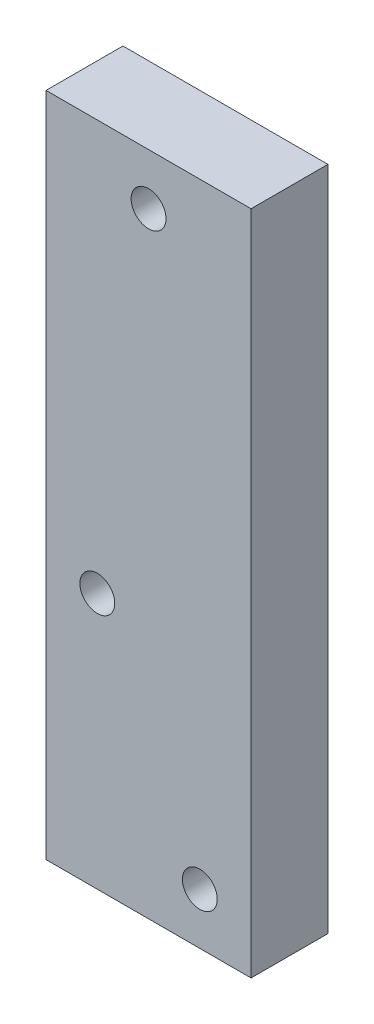
ISO-10303-21;
HEADER;
FILE_DESCRIPTION(('STEP AP214'),'2;1');
FILE_NAME('part.step','',(''),(''),'','','');
FILE_SCHEMA(('AUTOMOTIVE_DESIGN { 1 0 10303 214 1 1 1 1 }'));
ENDSEC;
DATA;
#1=APPLICATION_CONTEXT('core data for automotive mechanical design processes');
#2=APPLICATION_PROTOCOL_DEFINITION('international standard','automotive_design',2000,#1);
#3=PRODUCT_CONTEXT('',#1,'mechanical');
#4=PRODUCT('Part','Part','',(#3));
#5=PRODUCT_RELATED_PRODUCT_CATEGORY('part','',(#4));
#6=PRODUCT_DEFINITION_FORMATION('','',#4);
#7=PRODUCT_DEFINITION_CONTEXT('part definition',#1,'design');
#8=PRODUCT_DEFINITION('design','',#6,#7);
#9=PRODUCT_DEFINITION_SHAPE('','',#8);
#10=(LENGTH_UNIT() NAMED_UNIT(*) SI_UNIT(.MILLI.,.METRE.));
#11=(NAMED_UNIT(*) PLANE_ANGLE_UNIT() SI_UNIT($,.RADIAN.));
#12=(NAMED_UNIT(*) SI_UNIT($,.STERADIAN.) SOLID_ANGLE_UNIT());
#13=UNCERTAINTY_MEASURE_WITH_UNIT(LENGTH_MEASURE(1.E-05),#10,'distance_accuracy_value','');
#14=(GEOMETRIC_REPRESENTATION_CONTEXT(3) GLOBAL_UNCERTAINTY_ASSIGNED_CONTEXT((#13)) GLOBAL_UNIT_ASSIGNED_CONTEXT((#10,
#11,#12)) REPRESENTATION_CONTEXT('',''));
#15=CARTESIAN_POINT('',(0.,0.,0.));
#16=DIRECTION('',(0.,0.,1.));
#17=DIRECTION('',(1.,0.,0.));
#18=AXIS2_PLACEMENT_3D('',#15,#16,#17);
#19=CARTESIAN_POINT('',(0.,0.,9.525));
#20=DIRECTION('',(0.,0.,1.));
#21=DIRECTION('',(1.,0.,0.));
#22=AXIS2_PLACEMENT_3D('',#19,#20,#21);
#23=PLANE('',#22);
#24=CARTESIAN_POINT('',(-6.35,-44.45,9.525));
#25=DIRECTION('',(0.,0.,1.));
#26=DIRECTION('',(1.,0.,0.));
#27=AXIS2_PLACEMENT_3D('',#24,#25,#26);
#28=CIRCLE('',#27,2.159);
#29=CARTESIAN_POINT('',(-8.50900000000001,-44.45,9.525));
#30=VERTEX_POINT('',#29);
#31=EDGE_CURVE('E123',#30,#30,#28,.T.);
#32=ORIENTED_EDGE('',*,*,#31,.F.);
#33=EDGE_LOOP('',(#32));
#34=FACE_BOUND('',#33,.T.);
#35=DIRECTION('',(0.,-1.,0.));
#36=VECTOR('',#35,1.);
#37=CARTESIAN_POINT('',(-12.7,6.35,9.525));
#38=LINE('',#37,#36);
#39=CARTESIAN_POINT('',(-12.7,6.35,9.525));
#40=VERTEX_POINT('',#39);
#41=CARTESIAN_POINT('',(-12.7,-76.2,9.525));
#42=VERTEX_POINT('',#41);
#43=EDGE_CURVE('E93',#40,#42,#38,.T.);
#44=ORIENTED_EDGE('',*,*,#43,.T.);
#45=DIRECTION('',(1.,0.,0.));
#46=VECTOR('',#45,1.);
#47=CARTESIAN_POINT('',(-12.7,-76.2,9.525));
#48=LINE('',#47,#46);
#49=CARTESIAN_POINT('',(12.7,-76.2,9.525));
#50=VERTEX_POINT('',#49);
#51=EDGE_CURVE('E88',#42,#50,#48,.T.);
#52=ORIENTED_EDGE('',*,*,#51,.T.);
#53=DIRECTION('',(0.,1.,0.));
#54=VECTOR('',#53,1.);
#55=CARTESIAN_POINT('',(12.7,6.34999999999999,9.525));
#56=LINE('',#55,#54);
#57=CARTESIAN_POINT('',(12.7,6.34999999999999,9.525));
#58=VERTEX_POINT('',#57);
#59=EDGE_CURVE('E91',#50,#58,#56,.T.);
#60=ORIENTED_EDGE('',*,*,#59,.T.);
#61=DIRECTION('',(-1.,0.,0.));
#62=VECTOR('',#61,1.);
#63=CARTESIAN_POINT('',(-12.7,6.35,9.525));
#64=LINE('',#63,#62);
#65=EDGE_CURVE('E58',#58,#40,#64,.T.);
#66=ORIENTED_EDGE('',*,*,#65,.T.);
#67=EDGE_LOOP('',(#44,#52,#60,#66));
#68=FACE_BOUND('',#67,.T.);
#69=CARTESIAN_POINT('',(0.,0.,9.525));
#70=DIRECTION('',(0.,0.,1.));
#71=DIRECTION('',(1.,0.,0.));
#72=AXIS2_PLACEMENT_3D('',#69,#70,#71);
#73=CIRCLE('',#72,2.159);
#74=CARTESIAN_POINT('',(-2.159,0.,9.525));
#75=VERTEX_POINT('',#74);
#76=EDGE_CURVE('E108',#75,#75,#73,.T.);
#77=ORIENTED_EDGE('',*,*,#76,.F.);
#78=EDGE_LOOP('',(#77));
#79=FACE_BOUND('',#78,.T.);
#80=CARTESIAN_POINT('',(6.35,-69.85,9.525));
#81=DIRECTION('',(0.,0.,1.));
#82=DIRECTION('',(1.,0.,0.));
#83=AXIS2_PLACEMENT_3D('',#80,#81,#82);
#84=CIRCLE('',#83,2.159);
#85=CARTESIAN_POINT('',(4.191,-69.85,9.525));
#86=VERTEX_POINT('',#85);
#87=EDGE_CURVE('E129',#86,#86,#84,.T.);
#88=ORIENTED_EDGE('',*,*,#87,.F.);
#89=EDGE_LOOP('',(#88));
#90=FACE_BOUND('',#89,.T.);
#91=ADVANCED_FACE('F41',(#34,#68,#79,#90),#23,.T.);
#92=CARTESIAN_POINT('',(0.,0.,0.));
#93=DIRECTION('',(0.,0.,1.));
#94=DIRECTION('',(1.,0.,0.));
#95=AXIS2_PLACEMENT_3D('',#92,#93,#94);
#96=PLANE('',#95);
#97=DIRECTION('',(0.,-1.,0.));
#98=VECTOR('',#97,1.);
#99=CARTESIAN_POINT('',(-12.7,6.35,0.));
#100=LINE('',#99,#98);
#101=CARTESIAN_POINT('',(-12.7,6.35,0.));
#102=VERTEX_POINT('',#101);
#103=CARTESIAN_POINT('',(-12.7,-76.2,0.));
#104=VERTEX_POINT('',#103);
#105=EDGE_CURVE('E105',#102,#104,#100,.T.);
#106=ORIENTED_EDGE('',*,*,#105,.F.);
#107=DIRECTION('',(-1.,0.,0.));
#108=VECTOR('',#107,1.);
#109=CARTESIAN_POINT('',(-12.7,6.35,0.));
#110=LINE('',#109,#108);
#111=CARTESIAN_POINT('',(12.7,6.34999999999999,0.));
#112=VERTEX_POINT('',#111);
#113=EDGE_CURVE('E81',#112,#102,#110,.T.);
#114=ORIENTED_EDGE('',*,*,#113,.F.);
#115=DIRECTION('',(0.,1.,0.));
#116=VECTOR('',#115,1.);
#117=CARTESIAN_POINT('',(12.7,6.34999999999999,0.));
#118=LINE('',#117,#116);
#119=CARTESIAN_POINT('',(12.7,-76.2,0.));
#120=VERTEX_POINT('',#119);
#121=EDGE_CURVE('E75',#120,#112,#118,.T.);
#122=ORIENTED_EDGE('',*,*,#121,.F.);
#123=DIRECTION('',(1.,0.,0.));
#124=VECTOR('',#123,1.);
#125=CARTESIAN_POINT('',(-12.7,-76.2,0.));
#126=LINE('',#125,#124);
#127=EDGE_CURVE('E97',#104,#120,#126,.T.);
#128=ORIENTED_EDGE('',*,*,#127,.F.);
#129=EDGE_LOOP('',(#106,#114,#122,#128));
#130=FACE_BOUND('',#129,.T.);
#131=CARTESIAN_POINT('',(0.,0.,0.));
#132=DIRECTION('',(0.,0.,1.));
#133=DIRECTION('',(1.,0.,0.));
#134=AXIS2_PLACEMENT_3D('',#131,#132,#133);
#135=CIRCLE('',#134,2.159);
#136=CARTESIAN_POINT('',(-2.159,0.,0.));
#137=VERTEX_POINT('',#136);
#138=EDGE_CURVE('E120',#137,#137,#135,.T.);
#139=ORIENTED_EDGE('',*,*,#138,.T.);
#140=EDGE_LOOP('',(#139));
#141=FACE_BOUND('',#140,.T.);
#142=CARTESIAN_POINT('',(-6.35,-44.45,0.));
#143=DIRECTION('',(0.,0.,1.));
#144=DIRECTION('',(1.,0.,0.));
#145=AXIS2_PLACEMENT_3D('',#142,#143,#144);
#146=CIRCLE('',#145,2.159);
#147=CARTESIAN_POINT('',(-8.50900000000001,-44.45,0.));
#148=VERTEX_POINT('',#147);
#149=EDGE_CURVE('E126',#148,#148,#146,.T.);
#150=ORIENTED_EDGE('',*,*,#149,.T.);
#151=EDGE_LOOP('',(#150));
#152=FACE_BOUND('',#151,.T.);
#153=CARTESIAN_POINT('',(6.35,-69.85,0.));
#154=DIRECTION('',(0.,0.,1.));
#155=DIRECTION('',(1.,0.,0.));
#156=AXIS2_PLACEMENT_3D('',#153,#154,#155);
#157=CIRCLE('',#156,2.159);
#158=CARTESIAN_POINT('',(4.191,-69.85,0.));
#159=VERTEX_POINT('',#158);
#160=EDGE_CURVE('E132',#159,#159,#157,.T.);
#161=ORIENTED_EDGE('',*,*,#160,.T.);
#162=EDGE_LOOP('',(#161));
#163=FACE_BOUND('',#162,.T.);
#164=ADVANCED_FACE('F116',(#130,#141,#152,#163),#96,.F.);
#165=CARTESIAN_POINT('',(-12.7,6.35,9.525));
#166=DIRECTION('',(1.,0.,0.));
#167=DIRECTION('',(0.,1.,0.));
#168=AXIS2_PLACEMENT_3D('',#165,#166,#167);
#169=PLANE('',#168);
#170=ORIENTED_EDGE('',*,*,#105,.T.);
#171=DIRECTION('',(0.,0.,-1.));
#172=VECTOR('',#171,1.);
#173=CARTESIAN_POINT('',(-12.7,-76.2,9.525));
#174=LINE('',#173,#172);
#175=EDGE_CURVE('E11',#42,#104,#174,.T.);
#176=ORIENTED_EDGE('',*,*,#175,.F.);
#177=ORIENTED_EDGE('',*,*,#43,.F.);
#178=DIRECTION('',(0.,0.,-1.));
#179=VECTOR('',#178,1.);
#180=CARTESIAN_POINT('',(-12.7,6.35,9.525));
#181=LINE('',#180,#179);
#182=EDGE_CURVE('E101',#40,#102,#181,.T.);
#183=ORIENTED_EDGE('',*,*,#182,.T.);
#184=EDGE_LOOP('',(#170,#176,#177,#183));
#185=FACE_BOUND('',#184,.T.);
#186=ADVANCED_FACE('F43',(#185),#169,.F.);
#187=CARTESIAN_POINT('',(-12.7,-76.2,9.525));
#188=DIRECTION('',(0.,1.,0.));
#189=DIRECTION('',(0.,0.,1.));
#190=AXIS2_PLACEMENT_3D('',#187,#188,#189);
#191=PLANE('',#190);
#192=ORIENTED_EDGE('',*,*,#127,.T.);
#193=DIRECTION('',(0.,0.,-1.));
#194=VECTOR('',#193,1.);
#195=CARTESIAN_POINT('',(12.7,-76.2,9.525));
#196=LINE('',#195,#194);
#197=EDGE_CURVE('E50',#50,#120,#196,.T.);
#198=ORIENTED_EDGE('',*,*,#197,.F.);
#199=ORIENTED_EDGE('',*,*,#51,.F.);
#200=ORIENTED_EDGE('',*,*,#175,.T.);
#201=EDGE_LOOP('',(#192,#198,#199,#200));
#202=FACE_BOUND('',#201,.T.);
#203=ADVANCED_FACE('F96',(#202),#191,.F.);
#204=CARTESIAN_POINT('',(12.7,6.34999999999999,9.525));
#205=DIRECTION('',(-1.,0.,0.));
#206=DIRECTION('',(0.,-1.,0.));
#207=AXIS2_PLACEMENT_3D('',#204,#205,#206);
#208=PLANE('',#207);
#209=ORIENTED_EDGE('',*,*,#121,.T.);
#210=DIRECTION('',(0.,0.,-1.));
#211=VECTOR('',#210,1.);
#212=CARTESIAN_POINT('',(12.7,6.34999999999999,9.525));
#213=LINE('',#212,#211);
#214=EDGE_CURVE('E98',#58,#112,#213,.T.);
#215=ORIENTED_EDGE('',*,*,#214,.F.);
#216=ORIENTED_EDGE('',*,*,#59,.F.);
#217=ORIENTED_EDGE('',*,*,#197,.T.);
#218=EDGE_LOOP('',(#209,#215,#216,#217));
#219=FACE_BOUND('',#218,.T.);
#220=ADVANCED_FACE('F99',(#219),#208,.F.);
#221=CARTESIAN_POINT('',(-12.7,6.35,9.525));
#222=DIRECTION('',(0.,-1.,0.));
#223=DIRECTION('',(1.,0.,0.));
#224=AXIS2_PLACEMENT_3D('',#221,#222,#223);
#225=PLANE('',#224);
#226=ORIENTED_EDGE('',*,*,#113,.T.);
#227=ORIENTED_EDGE('',*,*,#182,.F.);
#228=ORIENTED_EDGE('',*,*,#65,.F.);
#229=ORIENTED_EDGE('',*,*,#214,.T.);
#230=EDGE_LOOP('',(#226,#227,#228,#229));
#231=FACE_BOUND('',#230,.T.);
#232=ADVANCED_FACE('F113',(#231),#225,.F.);
#233=CARTESIAN_POINT('',(0.,0.,9.525));
#234=DIRECTION('',(0.,0.,-1.));
#235=DIRECTION('',(-1.,0.,0.));
#236=AXIS2_PLACEMENT_3D('',#233,#234,#235);
#237=CYLINDRICAL_SURFACE('',#236,2.159);
#238=CARTESIAN_POINT('',(-2.159,0.,9.525));
#239=CARTESIAN_POINT('',(-2.159,0.,9.42578125));
#240=CARTESIAN_POINT('',(-2.159,0.,9.3265625));
#241=CARTESIAN_POINT('',(-2.159,0.,9.128125));
#242=CARTESIAN_POINT('',(-2.159,0.,9.02890625));
#243=CARTESIAN_POINT('',(-2.159,0.,8.83046875));
#244=CARTESIAN_POINT('',(-2.159,0.,8.73125));
#245=CARTESIAN_POINT('',(-2.159,0.,8.5328125));
#246=CARTESIAN_POINT('',(-2.159,0.,8.43359375));
#247=CARTESIAN_POINT('',(-2.159,0.,8.23515625));
#248=CARTESIAN_POINT('',(-2.159,0.,8.1359375));
#249=CARTESIAN_POINT('',(-2.159,0.,7.9375));
#250=CARTESIAN_POINT('',(-2.159,0.,7.83828125));
#251=CARTESIAN_POINT('',(-2.159,0.,7.63984375));
#252=CARTESIAN_POINT('',(-2.159,0.,7.540625));
#253=CARTESIAN_POINT('',(-2.159,0.,7.3421875));
#254=CARTESIAN_POINT('',(-2.159,0.,7.24296875));
#255=CARTESIAN_POINT('',(-2.159,0.,7.04453125));
#256=CARTESIAN_POINT('',(-2.159,0.,6.9453125));
#257=CARTESIAN_POINT('',(-2.159,0.,6.746875));
#258=CARTESIAN_POINT('',(-2.159,0.,6.64765625));
#259=CARTESIAN_POINT('',(-2.159,0.,6.44921875));
#260=CARTESIAN_POINT('',(-2.159,0.,6.35));
#261=CARTESIAN_POINT('',(-2.159,0.,6.1515625));
#262=CARTESIAN_POINT('',(-2.159,0.,6.05234375));
#263=CARTESIAN_POINT('',(-2.159,0.,5.85390625));
#264=CARTESIAN_POINT('',(-2.159,0.,5.7546875));
#265=CARTESIAN_POINT('',(-2.159,0.,5.55625));
#266=CARTESIAN_POINT('',(-2.159,0.,5.45703125));
#267=CARTESIAN_POINT('',(-2.159,0.,5.25859375));
#268=CARTESIAN_POINT('',(-2.159,0.,5.159375));
#269=CARTESIAN_POINT('',(-2.159,0.,4.9609375));
#270=CARTESIAN_POINT('',(-2.159,0.,4.86171875));
#271=CARTESIAN_POINT('',(-2.159,0.,4.66328125));
#272=CARTESIAN_POINT('',(-2.159,0.,4.5640625));
#273=CARTESIAN_POINT('',(-2.159,0.,4.365625));
#274=CARTESIAN_POINT('',(-2.159,0.,4.26640625));
#275=CARTESIAN_POINT('',(-2.159,0.,4.06796875));
#276=CARTESIAN_POINT('',(-2.159,0.,3.96875));
#277=CARTESIAN_POINT('',(-2.159,0.,3.7703125));
#278=CARTESIAN_POINT('',(-2.159,0.,3.67109375));
#279=CARTESIAN_POINT('',(-2.159,0.,3.47265625));
#280=CARTESIAN_POINT('',(-2.159,0.,3.3734375));
#281=CARTESIAN_POINT('',(-2.159,0.,3.175));
#282=CARTESIAN_POINT('',(-2.159,0.,3.07578125));
#283=CARTESIAN_POINT('',(-2.159,0.,2.87734375));
#284=CARTESIAN_POINT('',(-2.159,0.,2.778125));
#285=CARTESIAN_POINT('',(-2.159,0.,2.5796875));
#286=CARTESIAN_POINT('',(-2.159,0.,2.48046875));
#287=CARTESIAN_POINT('',(-2.159,0.,2.28203125));
#288=CARTESIAN_POINT('',(-2.159,0.,2.1828125));
#289=CARTESIAN_POINT('',(-2.159,0.,1.984375));
#290=CARTESIAN_POINT('',(-2.159,0.,1.88515625));
#291=CARTESIAN_POINT('',(-2.159,0.,1.68671875));
#292=CARTESIAN_POINT('',(-2.159,0.,1.5875));
#293=CARTESIAN_POINT('',(-2.159,0.,1.3890625));
#294=CARTESIAN_POINT('',(-2.159,0.,1.28984375));
#295=CARTESIAN_POINT('',(-2.159,0.,1.09140625));
#296=CARTESIAN_POINT('',(-2.159,0.,0.992187500000001));
#297=CARTESIAN_POINT('',(-2.159,0.,0.793750000000001));
#298=CARTESIAN_POINT('',(-2.159,0.,0.69453125));
#299=CARTESIAN_POINT('',(-2.159,0.,0.49609375));
#300=CARTESIAN_POINT('',(-2.159,0.,0.396875));
#301=CARTESIAN_POINT('',(-2.159,0.,0.1984375));
#302=CARTESIAN_POINT('',(-2.159,0.,0.0992187500000001));
#303=CARTESIAN_POINT('',(-2.159,0.,0.));
#304=B_SPLINE_CURVE_WITH_KNOTS('',3,(#238,#239,#240,#241,#242,#243,#244,#245,#246,#247,#248,
#249,#250,#251,#252,#253,#254,#255,#256,#257,#258,#259,#260,#261,#262,#263,#264,#265,#266,#267,
#268,#269,#270,#271,#272,#273,#274,#275,#276,#277,#278,#279,#280,#281,#282,#283,#284,#285,#286,
#287,#288,#289,#290,#291,#292,#293,#294,#295,#296,#297,#298,#299,#300,#301,#302,#303),
.UNSPECIFIED.,.F.,.F.,(4,2,2,2,2,2,2,2,2,2,2,2,2,2,2,2,2,2,2,2,2,2,2,2,2,2,2,2,2,2,2,2,4),(0.,
0.297656249999998,0.595312499999999,0.892968749999999,1.190625,1.48828125,1.7859375,2.08359375,
2.38125,2.67890625,2.9765625,3.27421875,3.571875,3.86953125,4.1671875,4.46484375,4.7625,
5.06015625,5.3578125,5.65546875,5.953125,6.25078125,6.5484375,6.84609375,7.14375,7.44140625,
7.7390625,8.03671875,8.334375,8.63203125,8.9296875,9.22734375,9.525),.UNSPECIFIED.);
#305=EDGE_CURVE('BSEAM150',#75,#137,#304,.T.);
#306=ORIENTED_EDGE('',*,*,#76,.T.);
#307=ORIENTED_EDGE('',*,*,#138,.F.);
#308=ORIENTED_EDGE('',*,*,#305,.T.);
#309=ORIENTED_EDGE('',*,*,#305,.F.);
#310=EDGE_LOOP('',(#306,#308,#307,#309));
#311=FACE_BOUND('',#310,.T.);
#312=ADVANCED_FACE('F150',(#311),#237,.F.);
#313=CARTESIAN_POINT('',(-6.35,-44.45,9.525));
#314=DIRECTION('',(0.,0.,-1.));
#315=DIRECTION('',(-1.,0.,0.));
#316=AXIS2_PLACEMENT_3D('',#313,#314,#315);
#317=CYLINDRICAL_SURFACE('',#316,2.159);
#318=CARTESIAN_POINT('',(-8.50900000000001,-44.45,9.525));
#319=CARTESIAN_POINT('',(-8.50900000000001,-44.45,9.42578125));
#320=CARTESIAN_POINT('',(-8.50900000000001,-44.45,9.3265625));
#321=CARTESIAN_POINT('',(-8.50900000000001,-44.45,9.128125));
#322=CARTESIAN_POINT('',(-8.50900000000001,-44.45,9.02890625));
#323=CARTESIAN_POINT('',(-8.50900000000001,-44.45,8.83046875));
#324=CARTESIAN_POINT('',(-8.50900000000001,-44.45,8.73125));
#325=CARTESIAN_POINT('',(-8.50900000000001,-44.45,8.5328125));
#326=CARTESIAN_POINT('',(-8.50900000000001,-44.45,8.43359375));
#327=CARTESIAN_POINT('',(-8.50900000000001,-44.45,8.23515625));
#328=CARTESIAN_POINT('',(-8.50900000000001,-44.45,8.1359375));
#329=CARTESIAN_POINT('',(-8.50900000000001,-44.45,7.9375));
#330=CARTESIAN_POINT('',(-8.50900000000001,-44.45,7.83828125));
#331=CARTESIAN_POINT('',(-8.50900000000001,-44.45,7.63984375));
#332=CARTESIAN_POINT('',(-8.50900000000001,-44.45,7.540625));
#333=CARTESIAN_POINT('',(-8.50900000000001,-44.45,7.3421875));
#334=CARTESIAN_POINT('',(-8.50900000000001,-44.45,7.24296875));
#335=CARTESIAN_POINT('',(-8.50900000000001,-44.45,7.04453125));
#336=CARTESIAN_POINT('',(-8.50900000000001,-44.45,6.9453125));
#337=CARTESIAN_POINT('',(-8.50900000000001,-44.45,6.746875));
#338=CARTESIAN_POINT('',(-8.50900000000001,-44.45,6.64765625));
#339=CARTESIAN_POINT('',(-8.50900000000001,-44.45,6.44921875));
#340=CARTESIAN_POINT('',(-8.50900000000001,-44.45,6.35));
#341=CARTESIAN_POINT('',(-8.50900000000001,-44.45,6.1515625));
#342=CARTESIAN_POINT('',(-8.50900000000001,-44.45,6.05234375));
#343=CARTESIAN_POINT('',(-8.50900000000001,-44.45,5.85390625));
#344=CARTESIAN_POINT('',(-8.50900000000001,-44.45,5.7546875));
#345=CARTESIAN_POINT('',(-8.50900000000001,-44.45,5.55625));
#346=CARTESIAN_POINT('',(-8.50900000000001,-44.45,5.45703125));
#347=CARTESIAN_POINT('',(-8.50900000000001,-44.45,5.25859375));
#348=CARTESIAN_POINT('',(-8.50900000000001,-44.45,5.159375));
#349=CARTESIAN_POINT('',(-8.50900000000001,-44.45,4.9609375));
#350=CARTESIAN_POINT('',(-8.50900000000001,-44.45,4.86171875));
#351=CARTESIAN_POINT('',(-8.50900000000001,-44.45,4.66328125));
#352=CARTESIAN_POINT('',(-8.50900000000001,-44.45,4.5640625));
#353=CARTESIAN_POINT('',(-8.50900000000001,-44.45,4.365625));
#354=CARTESIAN_POINT('',(-8.50900000000001,-44.45,4.26640625));
#355=CARTESIAN_POINT('',(-8.50900000000001,-44.45,4.06796875));
#356=CARTESIAN_POINT('',(-8.50900000000001,-44.45,3.96875));
#357=CARTESIAN_POINT('',(-8.50900000000001,-44.45,3.7703125));
#358=CARTESIAN_POINT('',(-8.50900000000001,-44.45,3.67109375));
#359=CARTESIAN_POINT('',(-8.50900000000001,-44.45,3.47265625));
#360=CARTESIAN_POINT('',(-8.50900000000001,-44.45,3.3734375));
#361=CARTESIAN_POINT('',(-8.50900000000001,-44.45,3.175));
#362=CARTESIAN_POINT('',(-8.50900000000001,-44.45,3.07578125));
#363=CARTESIAN_POINT('',(-8.50900000000001,-44.45,2.87734375));
#364=CARTESIAN_POINT('',(-8.50900000000001,-44.45,2.778125));
#365=CARTESIAN_POINT('',(-8.50900000000001,-44.45,2.5796875));
#366=CARTESIAN_POINT('',(-8.50900000000001,-44.45,2.48046875));
#367=CARTESIAN_POINT('',(-8.50900000000001,-44.45,2.28203125));
#368=CARTESIAN_POINT('',(-8.50900000000001,-44.45,2.1828125));
#369=CARTESIAN_POINT('',(-8.50900000000001,-44.45,1.984375));
#370=CARTESIAN_POINT('',(-8.50900000000001,-44.45,1.88515625));
#371=CARTESIAN_POINT('',(-8.50900000000001,-44.45,1.68671875));
#372=CARTESIAN_POINT('',(-8.50900000000001,-44.45,1.5875));
#373=CARTESIAN_POINT('',(-8.50900000000001,-44.45,1.3890625));
#374=CARTESIAN_POINT('',(-8.50900000000001,-44.45,1.28984375));
#375=CARTESIAN_POINT('',(-8.50900000000001,-44.45,1.09140625));
#376=CARTESIAN_POINT('',(-8.50900000000001,-44.45,0.992187500000001));
#377=CARTESIAN_POINT('',(-8.50900000000001,-44.45,0.793750000000001));
#378=CARTESIAN_POINT('',(-8.50900000000001,-44.45,0.69453125));
#379=CARTESIAN_POINT('',(-8.50900000000001,-44.45,0.49609375));
#380=CARTESIAN_POINT('',(-8.50900000000001,-44.45,0.396875));
#381=CARTESIAN_POINT('',(-8.50900000000001,-44.45,0.1984375));
#382=CARTESIAN_POINT('',(-8.50900000000001,-44.45,0.0992187500000001));
#383=CARTESIAN_POINT('',(-8.50900000000001,-44.45,0.));
#384=B_SPLINE_CURVE_WITH_KNOTS('',3,(#318,#319,#320,#321,#322,#323,#324,#325,#326,#327,#328,
#329,#330,#331,#332,#333,#334,#335,#336,#337,#338,#339,#340,#341,#342,#343,#344,#345,#346,#347,
#348,#349,#350,#351,#352,#353,#354,#355,#356,#357,#358,#359,#360,#361,#362,#363,#364,#365,#366,
#367,#368,#369,#370,#371,#372,#373,#374,#375,#376,#377,#378,#379,#380,#381,#382,#383),
.UNSPECIFIED.,.F.,.F.,(4,2,2,2,2,2,2,2,2,2,2,2,2,2,2,2,2,2,2,2,2,2,2,2,2,2,2,2,2,2,2,2,4),(0.,
0.297656249999998,0.595312499999999,0.892968749999999,1.190625,1.48828125,1.7859375,2.08359375,
2.38125,2.67890625,2.9765625,3.27421875,3.571875,3.86953125,4.1671875,4.46484375,4.7625,
5.06015625,5.3578125,5.65546875,5.953125,6.25078125,6.5484375,6.84609375,7.14375,7.44140625,
7.7390625,8.03671875,8.334375,8.63203125,8.9296875,9.22734375,9.525),.UNSPECIFIED.);
#385=EDGE_CURVE('BSEAM195',#30,#148,#384,.T.);
#386=ORIENTED_EDGE('',*,*,#31,.T.);
#387=ORIENTED_EDGE('',*,*,#149,.F.);
#388=ORIENTED_EDGE('',*,*,#385,.T.);
#389=ORIENTED_EDGE('',*,*,#385,.F.);
#390=EDGE_LOOP('',(#386,#388,#387,#389));
#391=FACE_BOUND('',#390,.T.);
#392=ADVANCED_FACE('F195',(#391),#317,.F.);
#393=CARTESIAN_POINT('',(6.35,-69.85,9.525));
#394=DIRECTION('',(0.,0.,-1.));
#395=DIRECTION('',(-1.,0.,0.));
#396=AXIS2_PLACEMENT_3D('',#393,#394,#395);
#397=CYLINDRICAL_SURFACE('',#396,2.159);
#398=CARTESIAN_POINT('',(4.191,-69.85,9.525));
#399=CARTESIAN_POINT('',(4.191,-69.85,9.42578125));
#400=CARTESIAN_POINT('',(4.191,-69.85,9.3265625));
#401=CARTESIAN_POINT('',(4.191,-69.85,9.128125));
#402=CARTESIAN_POINT('',(4.191,-69.85,9.02890625));
#403=CARTESIAN_POINT('',(4.191,-69.85,8.83046875));
#404=CARTESIAN_POINT('',(4.191,-69.85,8.73125));
#405=CARTESIAN_POINT('',(4.191,-69.85,8.5328125));
#406=CARTESIAN_POINT('',(4.191,-69.85,8.43359375));
#407=CARTESIAN_POINT('',(4.191,-69.85,8.23515625));
#408=CARTESIAN_POINT('',(4.191,-69.85,8.1359375));
#409=CARTESIAN_POINT('',(4.191,-69.85,7.9375));
#410=CARTESIAN_POINT('',(4.191,-69.85,7.83828125));
#411=CARTESIAN_POINT('',(4.191,-69.85,7.63984375));
#412=CARTESIAN_POINT('',(4.191,-69.85,7.540625));
#413=CARTESIAN_POINT('',(4.191,-69.85,7.3421875));
#414=CARTESIAN_POINT('',(4.191,-69.85,7.24296875));
#415=CARTESIAN_POINT('',(4.191,-69.85,7.04453125));
#416=CARTESIAN_POINT('',(4.191,-69.85,6.9453125));
#417=CARTESIAN_POINT('',(4.191,-69.85,6.746875));
#418=CARTESIAN_POINT('',(4.191,-69.85,6.64765625));
#419=CARTESIAN_POINT('',(4.191,-69.85,6.44921875));
#420=CARTESIAN_POINT('',(4.191,-69.85,6.35));
#421=CARTESIAN_POINT('',(4.191,-69.85,6.1515625));
#422=CARTESIAN_POINT('',(4.191,-69.85,6.05234375));
#423=CARTESIAN_POINT('',(4.191,-69.85,5.85390625));
#424=CARTESIAN_POINT('',(4.191,-69.85,5.7546875));
#425=CARTESIAN_POINT('',(4.191,-69.85,5.55625));
#426=CARTESIAN_POINT('',(4.191,-69.85,5.45703125));
#427=CARTESIAN_POINT('',(4.191,-69.85,5.25859375));
#428=CARTESIAN_POINT('',(4.191,-69.85,5.159375));
#429=CARTESIAN_POINT('',(4.191,-69.85,4.9609375));
#430=CARTESIAN_POINT('',(4.191,-69.85,4.86171875));
#431=CARTESIAN_POINT('',(4.191,-69.85,4.66328125));
#432=CARTESIAN_POINT('',(4.191,-69.85,4.5640625));
#433=CARTESIAN_POINT('',(4.191,-69.85,4.365625));
#434=CARTESIAN_POINT('',(4.191,-69.85,4.26640625));
#435=CARTESIAN_POINT('',(4.191,-69.85,4.06796875));
#436=CARTESIAN_POINT('',(4.191,-69.85,3.96875));
#437=CARTESIAN_POINT('',(4.191,-69.85,3.7703125));
#438=CARTESIAN_POINT('',(4.191,-69.85,3.67109375));
#439=CARTESIAN_POINT('',(4.191,-69.85,3.47265625));
#440=CARTESIAN_POINT('',(4.191,-69.85,3.3734375));
#441=CARTESIAN_POINT('',(4.191,-69.85,3.175));
#442=CARTESIAN_POINT('',(4.191,-69.85,3.07578125));
#443=CARTESIAN_POINT('',(4.191,-69.85,2.87734375));
#444=CARTESIAN_POINT('',(4.191,-69.85,2.778125));
#445=CARTESIAN_POINT('',(4.191,-69.85,2.5796875));
#446=CARTESIAN_POINT('',(4.191,-69.85,2.48046875));
#447=CARTESIAN_POINT('',(4.191,-69.85,2.28203125));
#448=CARTESIAN_POINT('',(4.191,-69.85,2.1828125));
#449=CARTESIAN_POINT('',(4.191,-69.85,1.984375));
#450=CARTESIAN_POINT('',(4.191,-69.85,1.88515625));
#451=CARTESIAN_POINT('',(4.191,-69.85,1.68671875));
#452=CARTESIAN_POINT('',(4.191,-69.85,1.5875));
#453=CARTESIAN_POINT('',(4.191,-69.85,1.3890625));
#454=CARTESIAN_POINT('',(4.191,-69.85,1.28984375));
#455=CARTESIAN_POINT('',(4.191,-69.85,1.09140625));
#456=CARTESIAN_POINT('',(4.191,-69.85,0.992187500000001));
#457=CARTESIAN_POINT('',(4.191,-69.85,0.793750000000001));
#458=CARTESIAN_POINT('',(4.191,-69.85,0.69453125));
#459=CARTESIAN_POINT('',(4.191,-69.85,0.49609375));
#460=CARTESIAN_POINT('',(4.191,-69.85,0.396875));
#461=CARTESIAN_POINT('',(4.191,-69.85,0.1984375));
#462=CARTESIAN_POINT('',(4.191,-69.85,0.0992187500000001));
#463=CARTESIAN_POINT('',(4.191,-69.85,0.));
#464=B_SPLINE_CURVE_WITH_KNOTS('',3,(#398,#399,#400,#401,#402,#403,#404,#405,#406,#407,#408,
#409,#410,#411,#412,#413,#414,#415,#416,#417,#418,#419,#420,#421,#422,#423,#424,#425,#426,#427,
#428,#429,#430,#431,#432,#433,#434,#435,#436,#437,#438,#439,#440,#441,#442,#443,#444,#445,#446,
#447,#448,#449,#450,#451,#452,#453,#454,#455,#456,#457,#458,#459,#460,#461,#462,#463),
.UNSPECIFIED.,.F.,.F.,(4,2,2,2,2,2,2,2,2,2,2,2,2,2,2,2,2,2,2,2,2,2,2,2,2,2,2,2,2,2,2,2,4),(0.,
0.297656249999998,0.595312499999999,0.892968749999999,1.190625,1.48828125,1.7859375,2.08359375,
2.38125,2.67890625,2.9765625,3.27421875,3.571875,3.86953125,4.1671875,4.46484375,4.7625,
5.06015625,5.3578125,5.65546875,5.953125,6.25078125,6.5484375,6.84609375,7.14375,7.44140625,
7.7390625,8.03671875,8.334375,8.63203125,8.9296875,9.22734375,9.525),.UNSPECIFIED.);
#465=EDGE_CURVE('BSEAM138',#86,#159,#464,.T.);
#466=ORIENTED_EDGE('',*,*,#87,.T.);
#467=ORIENTED_EDGE('',*,*,#160,.F.);
#468=ORIENTED_EDGE('',*,*,#465,.T.);
#469=ORIENTED_EDGE('',*,*,#465,.F.);
#470=EDGE_LOOP('',(#466,#468,#467,#469));
#471=FACE_BOUND('',#470,.T.);
#472=ADVANCED_FACE('F138',(#471),#397,.F.);
#473=CLOSED_SHELL('',(#91,#164,#186,#203,#220,#232,#312,#392,#472));
#474=MANIFOLD_SOLID_BREP('B2',#473);
#475=ADVANCED_BREP_SHAPE_REPRESENTATION('',(#18,#474),#14);
#476=SHAPE_DEFINITION_REPRESENTATION(#9,#475);
ENDSEC;
END-ISO-10303-21;
